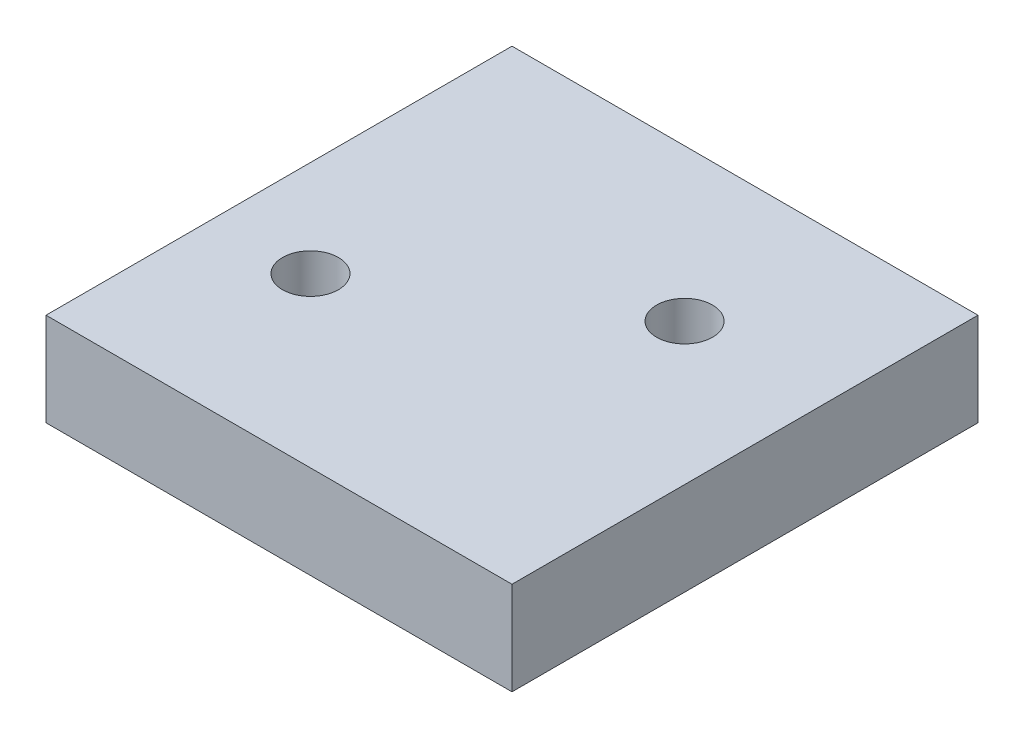
ISO-10303-21;
HEADER;
FILE_DESCRIPTION(('STEP AP214'),'2;1');
FILE_NAME('part.step','',(''),(''),'','','');
FILE_SCHEMA(('AUTOMOTIVE_DESIGN { 1 0 10303 214 1 1 1 1 }'));
ENDSEC;
DATA;
#1=APPLICATION_CONTEXT('core data for automotive mechanical design processes');
#2=APPLICATION_PROTOCOL_DEFINITION('international standard','automotive_design',2000,#1);
#3=PRODUCT_CONTEXT('',#1,'mechanical');
#4=PRODUCT('Part','Part','',(#3));
#5=PRODUCT_RELATED_PRODUCT_CATEGORY('part','',(#4));
#6=PRODUCT_DEFINITION_FORMATION('','',#4);
#7=PRODUCT_DEFINITION_CONTEXT('part definition',#1,'design');
#8=PRODUCT_DEFINITION('design','',#6,#7);
#9=PRODUCT_DEFINITION_SHAPE('','',#8);
#10=(LENGTH_UNIT() NAMED_UNIT(*) SI_UNIT(.MILLI.,.METRE.));
#11=(NAMED_UNIT(*) PLANE_ANGLE_UNIT() SI_UNIT($,.RADIAN.));
#12=(NAMED_UNIT(*) SI_UNIT($,.STERADIAN.) SOLID_ANGLE_UNIT());
#13=UNCERTAINTY_MEASURE_WITH_UNIT(LENGTH_MEASURE(1.E-05),#10,'distance_accuracy_value','');
#14=(GEOMETRIC_REPRESENTATION_CONTEXT(3) GLOBAL_UNCERTAINTY_ASSIGNED_CONTEXT((#13)) GLOBAL_UNIT_ASSIGNED_CONTEXT((#10,
#11,#12)) REPRESENTATION_CONTEXT('',''));
#15=CARTESIAN_POINT('',(0.,0.,0.));
#16=DIRECTION('',(0.,0.,1.));
#17=DIRECTION('',(1.,0.,0.));
#18=AXIS2_PLACEMENT_3D('',#15,#16,#17);
#19=CARTESIAN_POINT('',(0.,20.,0.));
#20=DIRECTION('',(1.,0.,0.));
#21=DIRECTION('',(0.,0.,-1.));
#22=AXIS2_PLACEMENT_3D('',#19,#20,#21);
#23=PLANE('',#22);
#24=DIRECTION('',(0.,0.,1.));
#25=VECTOR('',#24,1.);
#26=CARTESIAN_POINT('',(0.,0.,0.));
#27=LINE('',#26,#25);
#28=CARTESIAN_POINT('',(0.,0.,-100.));
#29=VERTEX_POINT('',#28);
#30=CARTESIAN_POINT('',(0.,0.,0.));
#31=VERTEX_POINT('',#30);
#32=EDGE_CURVE('E107',#29,#31,#27,.T.);
#33=ORIENTED_EDGE('',*,*,#32,.T.);
#34=DIRECTION('',(0.,-1.,0.));
#35=VECTOR('',#34,1.);
#36=CARTESIAN_POINT('',(0.,20.,0.));
#37=LINE('',#36,#35);
#38=CARTESIAN_POINT('',(0.,20.,0.));
#39=VERTEX_POINT('',#38);
#40=EDGE_CURVE('E11',#39,#31,#37,.T.);
#41=ORIENTED_EDGE('',*,*,#40,.F.);
#42=DIRECTION('',(0.,0.,1.));
#43=VECTOR('',#42,1.);
#44=CARTESIAN_POINT('',(0.,20.,0.));
#45=LINE('',#44,#43);
#46=CARTESIAN_POINT('',(0.,20.,-100.));
#47=VERTEX_POINT('',#46);
#48=EDGE_CURVE('E91',#47,#39,#45,.T.);
#49=ORIENTED_EDGE('',*,*,#48,.F.);
#50=DIRECTION('',(0.,-1.,0.));
#51=VECTOR('',#50,1.);
#52=CARTESIAN_POINT('',(0.,20.,-100.));
#53=LINE('',#52,#51);
#54=EDGE_CURVE('E103',#47,#29,#53,.T.);
#55=ORIENTED_EDGE('',*,*,#54,.T.);
#56=EDGE_LOOP('',(#33,#41,#49,#55));
#57=FACE_BOUND('',#56,.T.);
#58=ADVANCED_FACE('F39',(#57),#23,.F.);
#59=CARTESIAN_POINT('',(0.,20.,0.));
#60=DIRECTION('',(0.,0.,-1.));
#61=DIRECTION('',(-1.,0.,0.));
#62=AXIS2_PLACEMENT_3D('',#59,#60,#61);
#63=PLANE('',#62);
#64=DIRECTION('',(1.,0.,0.));
#65=VECTOR('',#64,1.);
#66=CARTESIAN_POINT('',(0.,0.,0.));
#67=LINE('',#66,#65);
#68=CARTESIAN_POINT('',(100.,0.,0.));
#69=VERTEX_POINT('',#68);
#70=EDGE_CURVE('E96',#31,#69,#67,.T.);
#71=ORIENTED_EDGE('',*,*,#70,.T.);
#72=DIRECTION('',(0.,-1.,0.));
#73=VECTOR('',#72,1.);
#74=CARTESIAN_POINT('',(100.,20.,0.));
#75=LINE('',#74,#73);
#76=CARTESIAN_POINT('',(100.,20.,0.));
#77=VERTEX_POINT('',#76);
#78=EDGE_CURVE('E48',#77,#69,#75,.T.);
#79=ORIENTED_EDGE('',*,*,#78,.F.);
#80=DIRECTION('',(1.,0.,0.));
#81=VECTOR('',#80,1.);
#82=CARTESIAN_POINT('',(0.,20.,0.));
#83=LINE('',#82,#81);
#84=EDGE_CURVE('E86',#39,#77,#83,.T.);
#85=ORIENTED_EDGE('',*,*,#84,.F.);
#86=ORIENTED_EDGE('',*,*,#40,.T.);
#87=EDGE_LOOP('',(#71,#79,#85,#86));
#88=FACE_BOUND('',#87,.T.);
#89=ADVANCED_FACE('F95',(#88),#63,.F.);
#90=CARTESIAN_POINT('',(100.,20.,0.));
#91=DIRECTION('',(-1.,0.,0.));
#92=DIRECTION('',(0.,0.,1.));
#93=AXIS2_PLACEMENT_3D('',#90,#91,#92);
#94=PLANE('',#93);
#95=DIRECTION('',(0.,0.,-1.));
#96=VECTOR('',#95,1.);
#97=CARTESIAN_POINT('',(100.,0.,0.));
#98=LINE('',#97,#96);
#99=CARTESIAN_POINT('',(100.,0.,-100.));
#100=VERTEX_POINT('',#99);
#101=EDGE_CURVE('E73',#69,#100,#98,.T.);
#102=ORIENTED_EDGE('',*,*,#101,.T.);
#103=DIRECTION('',(0.,-1.,0.));
#104=VECTOR('',#103,1.);
#105=CARTESIAN_POINT('',(100.,20.,-100.));
#106=LINE('',#105,#104);
#107=CARTESIAN_POINT('',(100.,20.,-100.));
#108=VERTEX_POINT('',#107);
#109=EDGE_CURVE('E98',#108,#100,#106,.T.);
#110=ORIENTED_EDGE('',*,*,#109,.F.);
#111=DIRECTION('',(0.,0.,-1.));
#112=VECTOR('',#111,1.);
#113=CARTESIAN_POINT('',(100.,20.,0.));
#114=LINE('',#113,#112);
#115=EDGE_CURVE('E89',#77,#108,#114,.T.);
#116=ORIENTED_EDGE('',*,*,#115,.F.);
#117=ORIENTED_EDGE('',*,*,#78,.T.);
#118=EDGE_LOOP('',(#102,#110,#116,#117));
#119=FACE_BOUND('',#118,.T.);
#120=ADVANCED_FACE('F99',(#119),#94,.F.);
#121=CARTESIAN_POINT('',(0.,20.,-100.));
#122=DIRECTION('',(0.,0.,1.));
#123=DIRECTION('',(1.,0.,0.));
#124=AXIS2_PLACEMENT_3D('',#121,#122,#123);
#125=PLANE('',#124);
#126=DIRECTION('',(-1.,0.,0.));
#127=VECTOR('',#126,1.);
#128=CARTESIAN_POINT('',(0.,0.,-100.));
#129=LINE('',#128,#127);
#130=EDGE_CURVE('E79',#100,#29,#129,.T.);
#131=ORIENTED_EDGE('',*,*,#130,.T.);
#132=ORIENTED_EDGE('',*,*,#54,.F.);
#133=DIRECTION('',(-1.,0.,0.));
#134=VECTOR('',#133,1.);
#135=CARTESIAN_POINT('',(0.,20.,-100.));
#136=LINE('',#135,#134);
#137=EDGE_CURVE('E56',#108,#47,#136,.T.);
#138=ORIENTED_EDGE('',*,*,#137,.F.);
#139=ORIENTED_EDGE('',*,*,#109,.T.);
#140=EDGE_LOOP('',(#131,#132,#138,#139));
#141=FACE_BOUND('',#140,.T.);
#142=ADVANCED_FACE('F121',(#141),#125,.F.);
#143=CARTESIAN_POINT('',(0.,20.,0.));
#144=DIRECTION('',(0.,-1.,0.));
#145=DIRECTION('',(0.,0.,-1.));
#146=AXIS2_PLACEMENT_3D('',#143,#144,#145);
#147=PLANE('',#146);
#148=CARTESIAN_POINT('',(69.6215657864059,20.,-67.4064803138208));
#149=DIRECTION('',(0.,1.,0.));
#150=DIRECTION('',(0.,0.,1.));
#151=AXIS2_PLACEMENT_3D('',#148,#149,#150);
#152=CIRCLE('',#151,6.00000000000001);
#153=CARTESIAN_POINT('',(69.6215657864059,20.,-61.4064803138208));
#154=VERTEX_POINT('',#153);
#155=EDGE_CURVE('E139',#154,#154,#152,.T.);
#156=ORIENTED_EDGE('',*,*,#155,.F.);
#157=EDGE_LOOP('',(#156));
#158=FACE_BOUND('',#157,.T.);
#159=CARTESIAN_POINT('',(20.647992381555,20.,-36.1029528276617));
#160=DIRECTION('',(0.,1.,0.));
#161=DIRECTION('',(0.,0.,1.));
#162=AXIS2_PLACEMENT_3D('',#159,#160,#161);
#163=CIRCLE('',#162,6.);
#164=CARTESIAN_POINT('',(20.647992381555,20.,-30.1029528276617));
#165=VERTEX_POINT('',#164);
#166=EDGE_CURVE('E131',#165,#165,#163,.T.);
#167=ORIENTED_EDGE('',*,*,#166,.F.);
#168=EDGE_LOOP('',(#167));
#169=FACE_BOUND('',#168,.T.);
#170=ORIENTED_EDGE('',*,*,#48,.T.);
#171=ORIENTED_EDGE('',*,*,#84,.T.);
#172=ORIENTED_EDGE('',*,*,#115,.T.);
#173=ORIENTED_EDGE('',*,*,#137,.T.);
#174=EDGE_LOOP('',(#170,#171,#172,#173));
#175=FACE_BOUND('',#174,.T.);
#176=ADVANCED_FACE('F87',(#158,#169,#175),#147,.F.);
#177=CARTESIAN_POINT('',(0.,0.,0.));
#178=DIRECTION('',(0.,-1.,0.));
#179=DIRECTION('',(0.,0.,-1.));
#180=AXIS2_PLACEMENT_3D('',#177,#178,#179);
#181=PLANE('',#180);
#182=CARTESIAN_POINT('',(69.6215657864059,0.,-67.4064803138208));
#183=DIRECTION('',(0.,1.,0.));
#184=DIRECTION('',(0.,0.,1.));
#185=AXIS2_PLACEMENT_3D('',#182,#183,#184);
#186=CIRCLE('',#185,5.99999999999999);
#187=CARTESIAN_POINT('',(69.6215657864059,0.,-61.4064803138208));
#188=VERTEX_POINT('',#187);
#189=EDGE_CURVE('E135',#188,#188,#186,.T.);
#190=ORIENTED_EDGE('',*,*,#189,.T.);
#191=EDGE_LOOP('',(#190));
#192=FACE_BOUND('',#191,.T.);
#193=CARTESIAN_POINT('',(20.647992381555,0.,-36.1029528276617));
#194=DIRECTION('',(0.,1.,0.));
#195=DIRECTION('',(0.,0.,1.));
#196=AXIS2_PLACEMENT_3D('',#193,#194,#195);
#197=CIRCLE('',#196,6.);
#198=CARTESIAN_POINT('',(20.647992381555,0.,-30.1029528276617));
#199=VERTEX_POINT('',#198);
#200=EDGE_CURVE('E111',#199,#199,#197,.T.);
#201=ORIENTED_EDGE('',*,*,#200,.T.);
#202=EDGE_LOOP('',(#201));
#203=FACE_BOUND('',#202,.T.);
#204=ORIENTED_EDGE('',*,*,#32,.F.);
#205=ORIENTED_EDGE('',*,*,#130,.F.);
#206=ORIENTED_EDGE('',*,*,#101,.F.);
#207=ORIENTED_EDGE('',*,*,#70,.F.);
#208=EDGE_LOOP('',(#204,#205,#206,#207));
#209=FACE_BOUND('',#208,.T.);
#210=ADVANCED_FACE('F124',(#192,#203,#209),#181,.T.);
#211=CARTESIAN_POINT('',(20.647992381555,20.,-36.1029528276617));
#212=DIRECTION('',(0.,1.,0.));
#213=DIRECTION('',(0.,0.,1.));
#214=AXIS2_PLACEMENT_3D('',#211,#212,#213);
#215=CYLINDRICAL_SURFACE('',#214,6.);
#216=ORIENTED_EDGE('',*,*,#200,.F.);
#217=EDGE_LOOP('',(#216));
#218=FACE_BOUND('',#217,.T.);
#219=ORIENTED_EDGE('',*,*,#166,.T.);
#220=EDGE_LOOP('',(#219));
#221=FACE_BOUND('',#220,.T.);
#222=ADVANCED_FACE('F151',(#218,#221),#215,.F.);
#223=CARTESIAN_POINT('',(69.6215657864059,20.,-67.4064803138208));
#224=DIRECTION('',(0.,1.,0.));
#225=DIRECTION('',(0.,0.,1.));
#226=AXIS2_PLACEMENT_3D('',#223,#224,#225);
#227=CYLINDRICAL_SURFACE('',#226,6.);
#228=ORIENTED_EDGE('',*,*,#189,.F.);
#229=EDGE_LOOP('',(#228));
#230=FACE_BOUND('',#229,.T.);
#231=ORIENTED_EDGE('',*,*,#155,.T.);
#232=EDGE_LOOP('',(#231));
#233=FACE_BOUND('',#232,.T.);
#234=ADVANCED_FACE('F144',(#230,#233),#227,.F.);
#235=CLOSED_SHELL('',(#58,#89,#120,#142,#176,#210,#222,#234));
#236=MANIFOLD_SOLID_BREP('B2',#235);
#237=ADVANCED_BREP_SHAPE_REPRESENTATION('',(#18,#236),#14);
#238=SHAPE_DEFINITION_REPRESENTATION(#9,#237);
ENDSEC;
END-ISO-10303-21;
